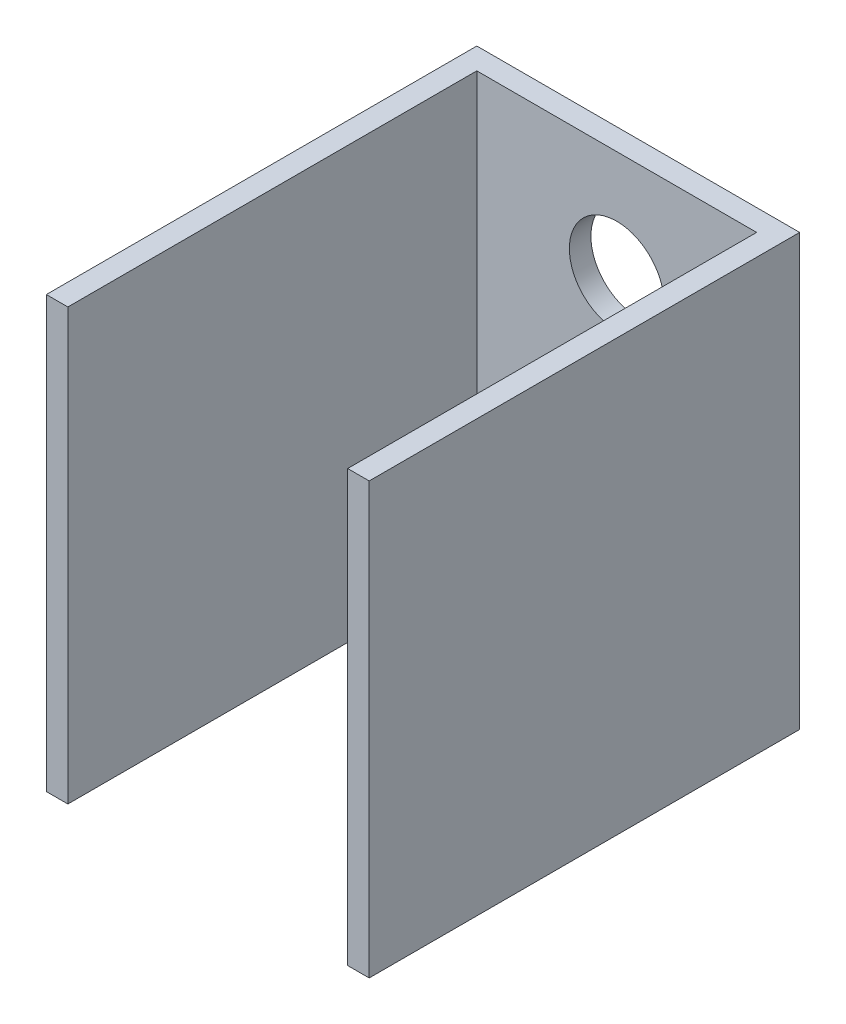
ISO-10303-21;
HEADER;
FILE_DESCRIPTION(('STEP AP214'),'2;1');
FILE_NAME('part.step','',(''),(''),'','','');
FILE_SCHEMA(('AUTOMOTIVE_DESIGN { 1 0 10303 214 1 1 1 1 }'));
ENDSEC;
DATA;
#1=APPLICATION_CONTEXT('core data for automotive mechanical design processes');
#2=APPLICATION_PROTOCOL_DEFINITION('international standard','automotive_design',2000,#1);
#3=PRODUCT_CONTEXT('',#1,'mechanical');
#4=PRODUCT('Part','Part','',(#3));
#5=PRODUCT_RELATED_PRODUCT_CATEGORY('part','',(#4));
#6=PRODUCT_DEFINITION_FORMATION('','',#4);
#7=PRODUCT_DEFINITION_CONTEXT('part definition',#1,'design');
#8=PRODUCT_DEFINITION('design','',#6,#7);
#9=PRODUCT_DEFINITION_SHAPE('','',#8);
#10=(LENGTH_UNIT() NAMED_UNIT(*) SI_UNIT(.MILLI.,.METRE.));
#11=(NAMED_UNIT(*) PLANE_ANGLE_UNIT() SI_UNIT($,.RADIAN.));
#12=(NAMED_UNIT(*) SI_UNIT($,.STERADIAN.) SOLID_ANGLE_UNIT());
#13=UNCERTAINTY_MEASURE_WITH_UNIT(LENGTH_MEASURE(1.E-05),#10,'distance_accuracy_value','');
#14=(GEOMETRIC_REPRESENTATION_CONTEXT(3) GLOBAL_UNCERTAINTY_ASSIGNED_CONTEXT((#13)) GLOBAL_UNIT_ASSIGNED_CONTEXT((#10,
#11,#12)) REPRESENTATION_CONTEXT('',''));
#15=CARTESIAN_POINT('',(0.,0.,0.));
#16=DIRECTION('',(0.,0.,1.));
#17=DIRECTION('',(1.,0.,0.));
#18=AXIS2_PLACEMENT_3D('',#15,#16,#17);
#19=CARTESIAN_POINT('',(7.5,20.,10.));
#20=DIRECTION('',(-1.,0.,0.));
#21=DIRECTION('',(0.,0.,1.));
#22=AXIS2_PLACEMENT_3D('',#19,#20,#21);
#23=PLANE('',#22);
#24=DIRECTION('',(0.,0.,-1.));
#25=VECTOR('',#24,1.);
#26=CARTESIAN_POINT('',(7.5,0.,10.));
#27=LINE('',#26,#25);
#28=CARTESIAN_POINT('',(7.5,0.,10.));
#29=VERTEX_POINT('',#28);
#30=CARTESIAN_POINT('',(7.5,0.,-10.));
#31=VERTEX_POINT('',#30);
#32=EDGE_CURVE('E146',#29,#31,#27,.T.);
#33=ORIENTED_EDGE('',*,*,#32,.T.);
#34=DIRECTION('',(0.,-1.,0.));
#35=VECTOR('',#34,1.);
#36=CARTESIAN_POINT('',(7.5,20.,-10.));
#37=LINE('',#36,#35);
#38=CARTESIAN_POINT('',(7.5,20.,-10.));
#39=VERTEX_POINT('',#38);
#40=EDGE_CURVE('E11',#39,#31,#37,.T.);
#41=ORIENTED_EDGE('',*,*,#40,.F.);
#42=DIRECTION('',(0.,0.,-1.));
#43=VECTOR('',#42,1.);
#44=CARTESIAN_POINT('',(7.5,20.,10.));
#45=LINE('',#44,#43);
#46=CARTESIAN_POINT('',(7.5,20.,10.));
#47=VERTEX_POINT('',#46);
#48=EDGE_CURVE('E167',#47,#39,#45,.T.);
#49=ORIENTED_EDGE('',*,*,#48,.F.);
#50=DIRECTION('',(0.,-1.,0.));
#51=VECTOR('',#50,1.);
#52=CARTESIAN_POINT('',(7.5,20.,10.));
#53=LINE('',#52,#51);
#54=EDGE_CURVE('E142',#47,#29,#53,.T.);
#55=ORIENTED_EDGE('',*,*,#54,.T.);
#56=EDGE_LOOP('',(#33,#41,#49,#55));
#57=FACE_BOUND('',#56,.T.);
#58=ADVANCED_FACE('F43',(#57),#23,.F.);
#59=CARTESIAN_POINT('',(-7.5,20.,-10.));
#60=DIRECTION('',(0.,0.,1.));
#61=DIRECTION('',(1.,0.,0.));
#62=AXIS2_PLACEMENT_3D('',#59,#60,#61);
#63=PLANE('',#62);
#64=CARTESIAN_POINT('',(0.,15.,-10.));
#65=DIRECTION('',(0.,0.,1.));
#66=DIRECTION('',(1.,0.,0.));
#67=AXIS2_PLACEMENT_3D('',#64,#65,#66);
#68=CIRCLE('',#67,2.2);
#69=CARTESIAN_POINT('',(2.2,15.,-10.));
#70=VERTEX_POINT('',#69);
#71=EDGE_CURVE('E151',#70,#70,#68,.T.);
#72=ORIENTED_EDGE('',*,*,#71,.T.);
#73=EDGE_LOOP('',(#72));
#74=FACE_BOUND('',#73,.T.);
#75=DIRECTION('',(-1.,0.,0.));
#76=VECTOR('',#75,1.);
#77=CARTESIAN_POINT('',(-7.5,0.,-10.));
#78=LINE('',#77,#76);
#79=CARTESIAN_POINT('',(-7.5,0.,-10.));
#80=VERTEX_POINT('',#79);
#81=EDGE_CURVE('E150',#31,#80,#78,.T.);
#82=ORIENTED_EDGE('',*,*,#81,.T.);
#83=DIRECTION('',(0.,-1.,0.));
#84=VECTOR('',#83,1.);
#85=CARTESIAN_POINT('',(-7.5,20.,-10.));
#86=LINE('',#85,#84);
#87=CARTESIAN_POINT('',(-7.5,20.,-10.));
#88=VERTEX_POINT('',#87);
#89=EDGE_CURVE('E52',#88,#80,#86,.T.);
#90=ORIENTED_EDGE('',*,*,#89,.F.);
#91=DIRECTION('',(-1.,0.,0.));
#92=VECTOR('',#91,1.);
#93=CARTESIAN_POINT('',(-7.5,20.,-10.));
#94=LINE('',#93,#92);
#95=EDGE_CURVE('E103',#39,#88,#94,.T.);
#96=ORIENTED_EDGE('',*,*,#95,.F.);
#97=ORIENTED_EDGE('',*,*,#40,.T.);
#98=EDGE_LOOP('',(#82,#90,#96,#97));
#99=FACE_BOUND('',#98,.T.);
#100=ADVANCED_FACE('F231',(#74,#99),#63,.F.);
#101=CARTESIAN_POINT('',(-7.5,20.,10.));
#102=DIRECTION('',(1.,0.,0.));
#103=DIRECTION('',(0.,0.,-1.));
#104=AXIS2_PLACEMENT_3D('',#101,#102,#103);
#105=PLANE('',#104);
#106=DIRECTION('',(0.,0.,1.));
#107=VECTOR('',#106,1.);
#108=CARTESIAN_POINT('',(-7.5,0.,10.));
#109=LINE('',#108,#107);
#110=CARTESIAN_POINT('',(-7.5,0.,10.));
#111=VERTEX_POINT('',#110);
#112=EDGE_CURVE('E154',#80,#111,#109,.T.);
#113=ORIENTED_EDGE('',*,*,#112,.T.);
#114=DIRECTION('',(0.,-1.,0.));
#115=VECTOR('',#114,1.);
#116=CARTESIAN_POINT('',(-7.5,20.,10.));
#117=LINE('',#116,#115);
#118=CARTESIAN_POINT('',(-7.5,20.,10.));
#119=VERTEX_POINT('',#118);
#120=EDGE_CURVE('E178',#119,#111,#117,.T.);
#121=ORIENTED_EDGE('',*,*,#120,.F.);
#122=DIRECTION('',(0.,0.,1.));
#123=VECTOR('',#122,1.);
#124=CARTESIAN_POINT('',(-7.5,20.,10.));
#125=LINE('',#124,#123);
#126=EDGE_CURVE('E189',#88,#119,#125,.T.);
#127=ORIENTED_EDGE('',*,*,#126,.F.);
#128=ORIENTED_EDGE('',*,*,#89,.T.);
#129=EDGE_LOOP('',(#113,#121,#127,#128));
#130=FACE_BOUND('',#129,.T.);
#131=ADVANCED_FACE('F187',(#130),#105,.F.);
#132=CARTESIAN_POINT('',(-7.5,20.,10.));
#133=DIRECTION('',(0.,0.,-1.));
#134=DIRECTION('',(-1.,0.,0.));
#135=AXIS2_PLACEMENT_3D('',#132,#133,#134);
#136=PLANE('',#135);
#137=DIRECTION('',(1.,0.,0.));
#138=VECTOR('',#137,1.);
#139=CARTESIAN_POINT('',(-7.5,0.,10.));
#140=LINE('',#139,#138);
#141=CARTESIAN_POINT('',(-6.5,0.,10.));
#142=VERTEX_POINT('',#141);
#143=EDGE_CURVE('E156',#111,#142,#140,.T.);
#144=ORIENTED_EDGE('',*,*,#143,.T.);
#145=DIRECTION('',(0.,-1.,0.));
#146=VECTOR('',#145,1.);
#147=CARTESIAN_POINT('',(-6.5,20.,10.));
#148=LINE('',#147,#146);
#149=CARTESIAN_POINT('',(-6.5,20.,10.));
#150=VERTEX_POINT('',#149);
#151=EDGE_CURVE('E174',#150,#142,#148,.T.);
#152=ORIENTED_EDGE('',*,*,#151,.F.);
#153=DIRECTION('',(1.,0.,0.));
#154=VECTOR('',#153,1.);
#155=CARTESIAN_POINT('',(-7.5,20.,10.));
#156=LINE('',#155,#154);
#157=EDGE_CURVE('E202',#119,#150,#156,.T.);
#158=ORIENTED_EDGE('',*,*,#157,.F.);
#159=ORIENTED_EDGE('',*,*,#120,.T.);
#160=EDGE_LOOP('',(#144,#152,#158,#159));
#161=FACE_BOUND('',#160,.T.);
#162=ADVANCED_FACE('F197',(#161),#136,.F.);
#163=CARTESIAN_POINT('',(-6.5,20.,10.));
#164=DIRECTION('',(-1.,0.,0.));
#165=DIRECTION('',(0.,0.,1.));
#166=AXIS2_PLACEMENT_3D('',#163,#164,#165);
#167=PLANE('',#166);
#168=DIRECTION('',(0.,0.,-1.));
#169=VECTOR('',#168,1.);
#170=CARTESIAN_POINT('',(-6.5,0.,10.));
#171=LINE('',#170,#169);
#172=CARTESIAN_POINT('',(-6.5,0.,-9.));
#173=VERTEX_POINT('',#172);
#174=EDGE_CURVE('E159',#142,#173,#171,.T.);
#175=ORIENTED_EDGE('',*,*,#174,.T.);
#176=DIRECTION('',(0.,-1.,0.));
#177=VECTOR('',#176,1.);
#178=CARTESIAN_POINT('',(-6.5,20.,-9.));
#179=LINE('',#178,#177);
#180=CARTESIAN_POINT('',(-6.5,20.,-9.));
#181=VERTEX_POINT('',#180);
#182=EDGE_CURVE('E133',#181,#173,#179,.T.);
#183=ORIENTED_EDGE('',*,*,#182,.F.);
#184=DIRECTION('',(0.,0.,-1.));
#185=VECTOR('',#184,1.);
#186=CARTESIAN_POINT('',(-6.5,20.,10.));
#187=LINE('',#186,#185);
#188=EDGE_CURVE('E122',#150,#181,#187,.T.);
#189=ORIENTED_EDGE('',*,*,#188,.F.);
#190=ORIENTED_EDGE('',*,*,#151,.T.);
#191=EDGE_LOOP('',(#175,#183,#189,#190));
#192=FACE_BOUND('',#191,.T.);
#193=ADVANCED_FACE('F200',(#192),#167,.F.);
#194=CARTESIAN_POINT('',(-6.5,20.,-9.));
#195=DIRECTION('',(0.,0.,-1.));
#196=DIRECTION('',(-1.,0.,0.));
#197=AXIS2_PLACEMENT_3D('',#194,#195,#196);
#198=PLANE('',#197);
#199=CARTESIAN_POINT('',(0.,15.,-9.));
#200=DIRECTION('',(0.,0.,1.));
#201=DIRECTION('',(1.,0.,0.));
#202=AXIS2_PLACEMENT_3D('',#199,#200,#201);
#203=CIRCLE('',#202,2.2);
#204=CARTESIAN_POINT('',(2.2,15.,-9.));
#205=VERTEX_POINT('',#204);
#206=EDGE_CURVE('E214',#205,#205,#203,.T.);
#207=ORIENTED_EDGE('',*,*,#206,.F.);
#208=EDGE_LOOP('',(#207));
#209=FACE_BOUND('',#208,.T.);
#210=DIRECTION('',(1.,0.,0.));
#211=VECTOR('',#210,1.);
#212=CARTESIAN_POINT('',(-6.5,0.,-9.));
#213=LINE('',#212,#211);
#214=CARTESIAN_POINT('',(6.5,0.,-9.));
#215=VERTEX_POINT('',#214);
#216=EDGE_CURVE('E131',#173,#215,#213,.T.);
#217=ORIENTED_EDGE('',*,*,#216,.T.);
#218=DIRECTION('',(0.,-1.,0.));
#219=VECTOR('',#218,1.);
#220=CARTESIAN_POINT('',(6.5,20.,-9.));
#221=LINE('',#220,#219);
#222=CARTESIAN_POINT('',(6.5,20.,-9.));
#223=VERTEX_POINT('',#222);
#224=EDGE_CURVE('E128',#223,#215,#221,.T.);
#225=ORIENTED_EDGE('',*,*,#224,.F.);
#226=DIRECTION('',(1.,0.,0.));
#227=VECTOR('',#226,1.);
#228=CARTESIAN_POINT('',(-6.5,20.,-9.));
#229=LINE('',#228,#227);
#230=EDGE_CURVE('E116',#181,#223,#229,.T.);
#231=ORIENTED_EDGE('',*,*,#230,.F.);
#232=ORIENTED_EDGE('',*,*,#182,.T.);
#233=EDGE_LOOP('',(#217,#225,#231,#232));
#234=FACE_BOUND('',#233,.T.);
#235=ADVANCED_FACE('F129',(#209,#234),#198,.F.);
#236=CARTESIAN_POINT('',(6.5,20.,10.));
#237=DIRECTION('',(1.,0.,0.));
#238=DIRECTION('',(0.,0.,-1.));
#239=AXIS2_PLACEMENT_3D('',#236,#237,#238);
#240=PLANE('',#239);
#241=DIRECTION('',(0.,0.,1.));
#242=VECTOR('',#241,1.);
#243=CARTESIAN_POINT('',(6.5,0.,10.));
#244=LINE('',#243,#242);
#245=CARTESIAN_POINT('',(6.5,0.,10.));
#246=VERTEX_POINT('',#245);
#247=EDGE_CURVE('E89',#215,#246,#244,.T.);
#248=ORIENTED_EDGE('',*,*,#247,.T.);
#249=DIRECTION('',(0.,-1.,0.));
#250=VECTOR('',#249,1.);
#251=CARTESIAN_POINT('',(6.5,20.,10.));
#252=LINE('',#251,#250);
#253=CARTESIAN_POINT('',(6.5,20.,10.));
#254=VERTEX_POINT('',#253);
#255=EDGE_CURVE('E134',#254,#246,#252,.T.);
#256=ORIENTED_EDGE('',*,*,#255,.F.);
#257=DIRECTION('',(0.,0.,1.));
#258=VECTOR('',#257,1.);
#259=CARTESIAN_POINT('',(6.5,20.,10.));
#260=LINE('',#259,#258);
#261=EDGE_CURVE('E120',#223,#254,#260,.T.);
#262=ORIENTED_EDGE('',*,*,#261,.F.);
#263=ORIENTED_EDGE('',*,*,#224,.T.);
#264=EDGE_LOOP('',(#248,#256,#262,#263));
#265=FACE_BOUND('',#264,.T.);
#266=ADVANCED_FACE('F136',(#265),#240,.F.);
#267=CARTESIAN_POINT('',(6.5,20.,10.));
#268=DIRECTION('',(0.,0.,-1.));
#269=DIRECTION('',(-1.,0.,0.));
#270=AXIS2_PLACEMENT_3D('',#267,#268,#269);
#271=PLANE('',#270);
#272=DIRECTION('',(1.,0.,0.));
#273=VECTOR('',#272,1.);
#274=CARTESIAN_POINT('',(6.5,0.,10.));
#275=LINE('',#274,#273);
#276=EDGE_CURVE('E95',#246,#29,#275,.T.);
#277=ORIENTED_EDGE('',*,*,#276,.T.);
#278=ORIENTED_EDGE('',*,*,#54,.F.);
#279=DIRECTION('',(1.,0.,0.));
#280=VECTOR('',#279,1.);
#281=CARTESIAN_POINT('',(6.5,20.,10.));
#282=LINE('',#281,#280);
#283=EDGE_CURVE('E60',#254,#47,#282,.T.);
#284=ORIENTED_EDGE('',*,*,#283,.F.);
#285=ORIENTED_EDGE('',*,*,#255,.T.);
#286=EDGE_LOOP('',(#277,#278,#284,#285));
#287=FACE_BOUND('',#286,.T.);
#288=ADVANCED_FACE('F227',(#287),#271,.F.);
#289=CARTESIAN_POINT('',(0.,20.,0.));
#290=DIRECTION('',(0.,-1.,0.));
#291=DIRECTION('',(0.,0.,-1.));
#292=AXIS2_PLACEMENT_3D('',#289,#290,#291);
#293=PLANE('',#292);
#294=ORIENTED_EDGE('',*,*,#48,.T.);
#295=ORIENTED_EDGE('',*,*,#95,.T.);
#296=ORIENTED_EDGE('',*,*,#126,.T.);
#297=ORIENTED_EDGE('',*,*,#157,.T.);
#298=ORIENTED_EDGE('',*,*,#188,.T.);
#299=ORIENTED_EDGE('',*,*,#230,.T.);
#300=ORIENTED_EDGE('',*,*,#261,.T.);
#301=ORIENTED_EDGE('',*,*,#283,.T.);
#302=EDGE_LOOP('',(#294,#295,#296,#297,#298,#299,#300,#301));
#303=FACE_BOUND('',#302,.T.);
#304=ADVANCED_FACE('F118',(#303),#293,.F.);
#305=CARTESIAN_POINT('',(0.,0.,0.));
#306=DIRECTION('',(0.,-1.,0.));
#307=DIRECTION('',(0.,0.,-1.));
#308=AXIS2_PLACEMENT_3D('',#305,#306,#307);
#309=PLANE('',#308);
#310=ORIENTED_EDGE('',*,*,#32,.F.);
#311=ORIENTED_EDGE('',*,*,#276,.F.);
#312=ORIENTED_EDGE('',*,*,#247,.F.);
#313=ORIENTED_EDGE('',*,*,#216,.F.);
#314=ORIENTED_EDGE('',*,*,#174,.F.);
#315=ORIENTED_EDGE('',*,*,#143,.F.);
#316=ORIENTED_EDGE('',*,*,#112,.F.);
#317=ORIENTED_EDGE('',*,*,#81,.F.);
#318=EDGE_LOOP('',(#310,#311,#312,#313,#314,#315,#316,#317));
#319=FACE_BOUND('',#318,.T.);
#320=ADVANCED_FACE('F193',(#319),#309,.T.);
#321=CARTESIAN_POINT('',(0.,15.,-9.));
#322=DIRECTION('',(0.,0.,1.));
#323=DIRECTION('',(1.,0.,0.));
#324=AXIS2_PLACEMENT_3D('',#321,#322,#323);
#325=CYLINDRICAL_SURFACE('',#324,2.2);
#326=ORIENTED_EDGE('',*,*,#71,.F.);
#327=EDGE_LOOP('',(#326));
#328=FACE_BOUND('',#327,.T.);
#329=ORIENTED_EDGE('',*,*,#206,.T.);
#330=EDGE_LOOP('',(#329));
#331=FACE_BOUND('',#330,.T.);
#332=ADVANCED_FACE('F219',(#328,#331),#325,.F.);
#333=CLOSED_SHELL('',(#58,#100,#131,#162,#193,#235,#266,#288,#304,#320,#332));
#334=MANIFOLD_SOLID_BREP('B2',#333);
#335=ADVANCED_BREP_SHAPE_REPRESENTATION('',(#18,#334),#14);
#336=SHAPE_DEFINITION_REPRESENTATION(#9,#335);
ENDSEC;
END-ISO-10303-21;
